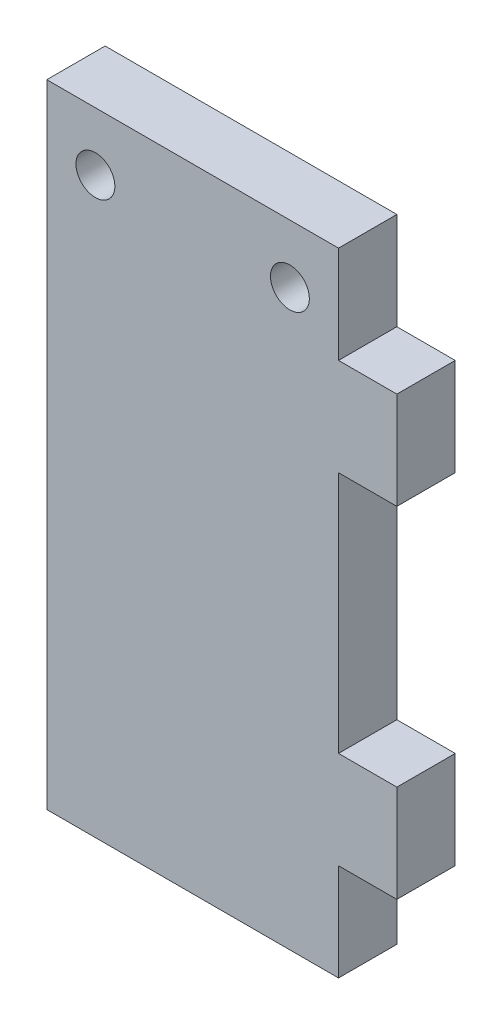
ISO-10303-21;
HEADER;
FILE_DESCRIPTION(('STEP AP214'),'2;1');
FILE_NAME('part.step','',(''),(''),'','','');
FILE_SCHEMA(('AUTOMOTIVE_DESIGN { 1 0 10303 214 1 1 1 1 }'));
ENDSEC;
DATA;
#1=APPLICATION_CONTEXT('core data for automotive mechanical design processes');
#2=APPLICATION_PROTOCOL_DEFINITION('international standard','automotive_design',2000,#1);
#3=PRODUCT_CONTEXT('',#1,'mechanical');
#4=PRODUCT('Part','Part','',(#3));
#5=PRODUCT_RELATED_PRODUCT_CATEGORY('part','',(#4));
#6=PRODUCT_DEFINITION_FORMATION('','',#4);
#7=PRODUCT_DEFINITION_CONTEXT('part definition',#1,'design');
#8=PRODUCT_DEFINITION('design','',#6,#7);
#9=PRODUCT_DEFINITION_SHAPE('','',#8);
#10=(LENGTH_UNIT() NAMED_UNIT(*) SI_UNIT(.MILLI.,.METRE.));
#11=(NAMED_UNIT(*) PLANE_ANGLE_UNIT() SI_UNIT($,.RADIAN.));
#12=(NAMED_UNIT(*) SI_UNIT($,.STERADIAN.) SOLID_ANGLE_UNIT());
#13=UNCERTAINTY_MEASURE_WITH_UNIT(LENGTH_MEASURE(1.E-05),#10,'distance_accuracy_value','');
#14=(GEOMETRIC_REPRESENTATION_CONTEXT(3) GLOBAL_UNCERTAINTY_ASSIGNED_CONTEXT((#13)) GLOBAL_UNIT_ASSIGNED_CONTEXT((#10,
#11,#12)) REPRESENTATION_CONTEXT('',''));
#15=CARTESIAN_POINT('',(0.,0.,0.));
#16=DIRECTION('',(0.,0.,1.));
#17=DIRECTION('',(1.,0.,0.));
#18=AXIS2_PLACEMENT_3D('',#15,#16,#17);
#19=CARTESIAN_POINT('',(0.,0.,6.));
#20=DIRECTION('',(-1.,0.,0.));
#21=DIRECTION('',(0.,-1.,0.));
#22=AXIS2_PLACEMENT_3D('',#19,#20,#21);
#23=PLANE('',#22);
#24=DIRECTION('',(0.,0.,-1.));
#25=VECTOR('',#24,1.);
#26=CARTESIAN_POINT('',(0.,45.,6.));
#27=LINE('',#26,#25);
#28=CARTESIAN_POINT('',(0.,45.,6.));
#29=VERTEX_POINT('',#28);
#30=CARTESIAN_POINT('',(0.,45.,0.));
#31=VERTEX_POINT('',#30);
#32=EDGE_CURVE('E57',#29,#31,#27,.T.);
#33=ORIENTED_EDGE('',*,*,#32,.F.);
#34=DIRECTION('',(0.,1.,0.));
#35=VECTOR('',#34,1.);
#36=CARTESIAN_POINT('',(0.,0.,6.));
#37=LINE('',#36,#35);
#38=CARTESIAN_POINT('',(0.,20.,6.));
#39=VERTEX_POINT('',#38);
#40=EDGE_CURVE('E148',#39,#29,#37,.T.);
#41=ORIENTED_EDGE('',*,*,#40,.F.);
#42=DIRECTION('',(0.,0.,1.));
#43=VECTOR('',#42,1.);
#44=CARTESIAN_POINT('',(0.,20.,6.));
#45=LINE('',#44,#43);
#46=CARTESIAN_POINT('',(0.,20.,0.));
#47=VERTEX_POINT('',#46);
#48=EDGE_CURVE('E152',#47,#39,#45,.T.);
#49=ORIENTED_EDGE('',*,*,#48,.F.);
#50=DIRECTION('',(0.,1.,0.));
#51=VECTOR('',#50,1.);
#52=CARTESIAN_POINT('',(0.,0.,0.));
#53=LINE('',#52,#51);
#54=EDGE_CURVE('E195',#47,#31,#53,.T.);
#55=ORIENTED_EDGE('',*,*,#54,.T.);
#56=EDGE_LOOP('',(#33,#41,#49,#55));
#57=FACE_BOUND('',#56,.T.);
#58=ADVANCED_FACE('F33',(#57),#23,.F.);
#59=DIRECTION('',(0.,0.,1.));
#60=VECTOR('',#59,1.);
#61=CARTESIAN_POINT('',(0.,55.,6.));
#62=LINE('',#61,#60);
#63=CARTESIAN_POINT('',(0.,55.,0.));
#64=VERTEX_POINT('',#63);
#65=CARTESIAN_POINT('',(0.,55.,6.));
#66=VERTEX_POINT('',#65);
#67=EDGE_CURVE('E143',#64,#66,#62,.T.);
#68=ORIENTED_EDGE('',*,*,#67,.F.);
#69=CARTESIAN_POINT('',(0.,65.,0.));
#70=VERTEX_POINT('',#69);
#71=EDGE_CURVE('E183',#64,#70,#53,.T.);
#72=ORIENTED_EDGE('',*,*,#71,.T.);
#73=DIRECTION('',(0.,0.,-1.));
#74=VECTOR('',#73,1.);
#75=CARTESIAN_POINT('',(0.,65.,6.));
#76=LINE('',#75,#74);
#77=CARTESIAN_POINT('',(0.,65.,6.));
#78=VERTEX_POINT('',#77);
#79=EDGE_CURVE('E11',#78,#70,#76,.T.);
#80=ORIENTED_EDGE('',*,*,#79,.F.);
#81=EDGE_CURVE('E36',#66,#78,#37,.T.);
#82=ORIENTED_EDGE('',*,*,#81,.F.);
#83=EDGE_LOOP('',(#68,#72,#80,#82));
#84=FACE_BOUND('',#83,.T.);
#85=ADVANCED_FACE('F248',(#84),#23,.F.);
#86=DIRECTION('',(0.,0.,-1.));
#87=VECTOR('',#86,1.);
#88=CARTESIAN_POINT('',(0.,10.,6.));
#89=LINE('',#88,#87);
#90=CARTESIAN_POINT('',(0.,10.,6.));
#91=VERTEX_POINT('',#90);
#92=CARTESIAN_POINT('',(0.,10.,0.));
#93=VERTEX_POINT('',#92);
#94=EDGE_CURVE('E149',#91,#93,#89,.T.);
#95=ORIENTED_EDGE('',*,*,#94,.F.);
#96=CARTESIAN_POINT('',(0.,0.,6.));
#97=VERTEX_POINT('',#96);
#98=EDGE_CURVE('E241',#97,#91,#37,.T.);
#99=ORIENTED_EDGE('',*,*,#98,.F.);
#100=DIRECTION('',(0.,0.,-1.));
#101=VECTOR('',#100,1.);
#102=CARTESIAN_POINT('',(0.,0.,6.));
#103=LINE('',#102,#101);
#104=CARTESIAN_POINT('',(0.,0.,0.));
#105=VERTEX_POINT('',#104);
#106=EDGE_CURVE('E214',#97,#105,#103,.T.);
#107=ORIENTED_EDGE('',*,*,#106,.T.);
#108=EDGE_CURVE('E207',#105,#93,#53,.T.);
#109=ORIENTED_EDGE('',*,*,#108,.T.);
#110=EDGE_LOOP('',(#95,#99,#107,#109));
#111=FACE_BOUND('',#110,.T.);
#112=ADVANCED_FACE('F240',(#111),#23,.F.);
#113=CARTESIAN_POINT('',(0.,65.,6.));
#114=DIRECTION('',(0.,-1.,0.));
#115=DIRECTION('',(0.,0.,-1.));
#116=AXIS2_PLACEMENT_3D('',#113,#114,#115);
#117=PLANE('',#116);
#118=DIRECTION('',(-1.,0.,0.));
#119=VECTOR('',#118,1.);
#120=CARTESIAN_POINT('',(0.,65.,0.));
#121=LINE('',#120,#119);
#122=CARTESIAN_POINT('',(-30.,65.,0.));
#123=VERTEX_POINT('',#122);
#124=EDGE_CURVE('E201',#70,#123,#121,.T.);
#125=ORIENTED_EDGE('',*,*,#124,.T.);
#126=DIRECTION('',(0.,0.,-1.));
#127=VECTOR('',#126,1.);
#128=CARTESIAN_POINT('',(-30.,65.,6.));
#129=LINE('',#128,#127);
#130=CARTESIAN_POINT('',(-30.,65.,6.));
#131=VERTEX_POINT('',#130);
#132=EDGE_CURVE('E42',#131,#123,#129,.T.);
#133=ORIENTED_EDGE('',*,*,#132,.F.);
#134=DIRECTION('',(-1.,0.,0.));
#135=VECTOR('',#134,1.);
#136=CARTESIAN_POINT('',(0.,65.,6.));
#137=LINE('',#136,#135);
#138=EDGE_CURVE('E243',#78,#131,#137,.T.);
#139=ORIENTED_EDGE('',*,*,#138,.F.);
#140=ORIENTED_EDGE('',*,*,#79,.T.);
#141=EDGE_LOOP('',(#125,#133,#139,#140));
#142=FACE_BOUND('',#141,.T.);
#143=ADVANCED_FACE('F225',(#142),#117,.F.);
#144=CARTESIAN_POINT('',(-30.,0.,6.));
#145=DIRECTION('',(1.,0.,0.));
#146=DIRECTION('',(0.,0.,-1.));
#147=AXIS2_PLACEMENT_3D('',#144,#145,#146);
#148=PLANE('',#147);
#149=DIRECTION('',(0.,-1.,0.));
#150=VECTOR('',#149,1.);
#151=CARTESIAN_POINT('',(-30.,0.,0.));
#152=LINE('',#151,#150);
#153=CARTESIAN_POINT('',(-30.,0.,0.));
#154=VERTEX_POINT('',#153);
#155=EDGE_CURVE('E218',#123,#154,#152,.T.);
#156=ORIENTED_EDGE('',*,*,#155,.T.);
#157=DIRECTION('',(0.,0.,-1.));
#158=VECTOR('',#157,1.);
#159=CARTESIAN_POINT('',(-30.,0.,6.));
#160=LINE('',#159,#158);
#161=CARTESIAN_POINT('',(-30.,0.,6.));
#162=VERTEX_POINT('',#161);
#163=EDGE_CURVE('E211',#162,#154,#160,.T.);
#164=ORIENTED_EDGE('',*,*,#163,.F.);
#165=DIRECTION('',(0.,-1.,0.));
#166=VECTOR('',#165,1.);
#167=CARTESIAN_POINT('',(-30.,0.,6.));
#168=LINE('',#167,#166);
#169=EDGE_CURVE('E230',#131,#162,#168,.T.);
#170=ORIENTED_EDGE('',*,*,#169,.F.);
#171=ORIENTED_EDGE('',*,*,#132,.T.);
#172=EDGE_LOOP('',(#156,#164,#170,#171));
#173=FACE_BOUND('',#172,.T.);
#174=ADVANCED_FACE('F229',(#173),#148,.F.);
#175=CARTESIAN_POINT('',(0.,0.,6.));
#176=DIRECTION('',(0.,1.,0.));
#177=DIRECTION('',(-1.,0.,0.));
#178=AXIS2_PLACEMENT_3D('',#175,#176,#177);
#179=PLANE('',#178);
#180=DIRECTION('',(1.,0.,0.));
#181=VECTOR('',#180,1.);
#182=CARTESIAN_POINT('',(0.,0.,0.));
#183=LINE('',#182,#181);
#184=EDGE_CURVE('E217',#154,#105,#183,.T.);
#185=ORIENTED_EDGE('',*,*,#184,.T.);
#186=ORIENTED_EDGE('',*,*,#106,.F.);
#187=DIRECTION('',(1.,0.,0.));
#188=VECTOR('',#187,1.);
#189=CARTESIAN_POINT('',(0.,0.,6.));
#190=LINE('',#189,#188);
#191=EDGE_CURVE('E199',#162,#97,#190,.T.);
#192=ORIENTED_EDGE('',*,*,#191,.F.);
#193=ORIENTED_EDGE('',*,*,#163,.T.);
#194=EDGE_LOOP('',(#185,#186,#192,#193));
#195=FACE_BOUND('',#194,.T.);
#196=ADVANCED_FACE('F236',(#195),#179,.F.);
#197=CARTESIAN_POINT('',(0.,0.,6.));
#198=DIRECTION('',(0.,0.,1.));
#199=DIRECTION('',(1.,0.,0.));
#200=AXIS2_PLACEMENT_3D('',#197,#198,#199);
#201=PLANE('',#200);
#202=CARTESIAN_POINT('',(-5.,59.,6.));
#203=DIRECTION('',(0.,0.,1.));
#204=DIRECTION('',(1.,0.,0.));
#205=AXIS2_PLACEMENT_3D('',#202,#203,#204);
#206=CIRCLE('',#205,2.);
#207=CARTESIAN_POINT('',(-2.99999999999999,59.,6.));
#208=VERTEX_POINT('',#207);
#209=EDGE_CURVE('E269',#208,#208,#206,.T.);
#210=ORIENTED_EDGE('',*,*,#209,.F.);
#211=EDGE_LOOP('',(#210));
#212=FACE_BOUND('',#211,.T.);
#213=CARTESIAN_POINT('',(-25.,59.,6.));
#214=DIRECTION('',(0.,0.,1.));
#215=DIRECTION('',(1.,0.,0.));
#216=AXIS2_PLACEMENT_3D('',#213,#214,#215);
#217=CIRCLE('',#216,2.00000000000001);
#218=CARTESIAN_POINT('',(-23.,59.,6.));
#219=VERTEX_POINT('',#218);
#220=EDGE_CURVE('E261',#219,#219,#217,.T.);
#221=ORIENTED_EDGE('',*,*,#220,.F.);
#222=EDGE_LOOP('',(#221));
#223=FACE_BOUND('',#222,.T.);
#224=ORIENTED_EDGE('',*,*,#98,.T.);
#225=DIRECTION('',(-1.,0.,0.));
#226=VECTOR('',#225,1.);
#227=CARTESIAN_POINT('',(6.,10.,6.));
#228=LINE('',#227,#226);
#229=CARTESIAN_POINT('',(6.,10.,6.));
#230=VERTEX_POINT('',#229);
#231=EDGE_CURVE('E177',#230,#91,#228,.T.);
#232=ORIENTED_EDGE('',*,*,#231,.F.);
#233=DIRECTION('',(0.,-1.,0.));
#234=VECTOR('',#233,1.);
#235=CARTESIAN_POINT('',(6.,20.,6.));
#236=LINE('',#235,#234);
#237=CARTESIAN_POINT('',(6.,20.,6.));
#238=VERTEX_POINT('',#237);
#239=EDGE_CURVE('E158',#238,#230,#236,.T.);
#240=ORIENTED_EDGE('',*,*,#239,.F.);
#241=DIRECTION('',(-1.,0.,0.));
#242=VECTOR('',#241,1.);
#243=CARTESIAN_POINT('',(6.,20.,6.));
#244=LINE('',#243,#242);
#245=EDGE_CURVE('E167',#238,#39,#244,.T.);
#246=ORIENTED_EDGE('',*,*,#245,.T.);
#247=ORIENTED_EDGE('',*,*,#40,.T.);
#248=DIRECTION('',(-1.,0.,0.));
#249=VECTOR('',#248,1.);
#250=CARTESIAN_POINT('',(6.,45.,6.));
#251=LINE('',#250,#249);
#252=CARTESIAN_POINT('',(6.,45.,6.));
#253=VERTEX_POINT('',#252);
#254=EDGE_CURVE('E128',#253,#29,#251,.T.);
#255=ORIENTED_EDGE('',*,*,#254,.F.);
#256=DIRECTION('',(0.,-1.,0.));
#257=VECTOR('',#256,1.);
#258=CARTESIAN_POINT('',(6.,55.,6.));
#259=LINE('',#258,#257);
#260=CARTESIAN_POINT('',(6.,55.,6.));
#261=VERTEX_POINT('',#260);
#262=EDGE_CURVE('E134',#261,#253,#259,.T.);
#263=ORIENTED_EDGE('',*,*,#262,.F.);
#264=DIRECTION('',(-1.,0.,0.));
#265=VECTOR('',#264,1.);
#266=CARTESIAN_POINT('',(6.,55.,6.));
#267=LINE('',#266,#265);
#268=EDGE_CURVE('E252',#261,#66,#267,.T.);
#269=ORIENTED_EDGE('',*,*,#268,.T.);
#270=ORIENTED_EDGE('',*,*,#81,.T.);
#271=ORIENTED_EDGE('',*,*,#138,.T.);
#272=ORIENTED_EDGE('',*,*,#169,.T.);
#273=ORIENTED_EDGE('',*,*,#191,.T.);
#274=EDGE_LOOP('',(#224,#232,#240,#246,#247,#255,#263,#269,#270,#271,#272,#273));
#275=FACE_BOUND('',#274,.T.);
#276=ADVANCED_FACE('F146',(#212,#223,#275),#201,.T.);
#277=CARTESIAN_POINT('',(0.,0.,0.));
#278=DIRECTION('',(0.,0.,1.));
#279=DIRECTION('',(1.,0.,0.));
#280=AXIS2_PLACEMENT_3D('',#277,#278,#279);
#281=PLANE('',#280);
#282=CARTESIAN_POINT('',(-5.,59.,0.));
#283=DIRECTION('',(0.,0.,1.));
#284=DIRECTION('',(1.,0.,0.));
#285=AXIS2_PLACEMENT_3D('',#282,#283,#284);
#286=CIRCLE('',#285,2.);
#287=CARTESIAN_POINT('',(-2.99999999999999,59.,0.));
#288=VERTEX_POINT('',#287);
#289=EDGE_CURVE('E266',#288,#288,#286,.T.);
#290=ORIENTED_EDGE('',*,*,#289,.T.);
#291=EDGE_LOOP('',(#290));
#292=FACE_BOUND('',#291,.T.);
#293=CARTESIAN_POINT('',(-25.,59.,0.));
#294=DIRECTION('',(0.,0.,1.));
#295=DIRECTION('',(1.,0.,0.));
#296=AXIS2_PLACEMENT_3D('',#293,#294,#295);
#297=CIRCLE('',#296,2.00000000000001);
#298=CARTESIAN_POINT('',(-23.,59.,0.));
#299=VERTEX_POINT('',#298);
#300=EDGE_CURVE('E259',#299,#299,#297,.T.);
#301=ORIENTED_EDGE('',*,*,#300,.T.);
#302=EDGE_LOOP('',(#301));
#303=FACE_BOUND('',#302,.T.);
#304=ORIENTED_EDGE('',*,*,#108,.F.);
#305=ORIENTED_EDGE('',*,*,#184,.F.);
#306=ORIENTED_EDGE('',*,*,#155,.F.);
#307=ORIENTED_EDGE('',*,*,#124,.F.);
#308=ORIENTED_EDGE('',*,*,#71,.F.);
#309=DIRECTION('',(-1.,0.,0.));
#310=VECTOR('',#309,1.);
#311=CARTESIAN_POINT('',(6.,55.,0.));
#312=LINE('',#311,#310);
#313=CARTESIAN_POINT('',(6.,55.,0.));
#314=VERTEX_POINT('',#313);
#315=EDGE_CURVE('E154',#314,#64,#312,.T.);
#316=ORIENTED_EDGE('',*,*,#315,.F.);
#317=DIRECTION('',(0.,1.,0.));
#318=VECTOR('',#317,1.);
#319=CARTESIAN_POINT('',(6.,55.,0.));
#320=LINE('',#319,#318);
#321=CARTESIAN_POINT('',(6.,45.,0.));
#322=VERTEX_POINT('',#321);
#323=EDGE_CURVE('E133',#322,#314,#320,.T.);
#324=ORIENTED_EDGE('',*,*,#323,.F.);
#325=DIRECTION('',(-1.,0.,0.));
#326=VECTOR('',#325,1.);
#327=CARTESIAN_POINT('',(6.,45.,0.));
#328=LINE('',#327,#326);
#329=EDGE_CURVE('E130',#322,#31,#328,.T.);
#330=ORIENTED_EDGE('',*,*,#329,.T.);
#331=ORIENTED_EDGE('',*,*,#54,.F.);
#332=DIRECTION('',(-1.,0.,0.));
#333=VECTOR('',#332,1.);
#334=CARTESIAN_POINT('',(6.,20.,0.));
#335=LINE('',#334,#333);
#336=CARTESIAN_POINT('',(6.,20.,0.));
#337=VERTEX_POINT('',#336);
#338=EDGE_CURVE('E178',#337,#47,#335,.T.);
#339=ORIENTED_EDGE('',*,*,#338,.F.);
#340=DIRECTION('',(0.,1.,0.));
#341=VECTOR('',#340,1.);
#342=CARTESIAN_POINT('',(6.,20.,0.));
#343=LINE('',#342,#341);
#344=CARTESIAN_POINT('',(6.,10.,0.));
#345=VERTEX_POINT('',#344);
#346=EDGE_CURVE('E163',#345,#337,#343,.T.);
#347=ORIENTED_EDGE('',*,*,#346,.F.);
#348=DIRECTION('',(-1.,0.,0.));
#349=VECTOR('',#348,1.);
#350=CARTESIAN_POINT('',(6.,10.,0.));
#351=LINE('',#350,#349);
#352=EDGE_CURVE('E174',#345,#93,#351,.T.);
#353=ORIENTED_EDGE('',*,*,#352,.T.);
#354=EDGE_LOOP('',(#304,#305,#306,#307,#308,#316,#324,#330,#331,#339,#347,#353));
#355=FACE_BOUND('',#354,.T.);
#356=ADVANCED_FACE('F233',(#292,#303,#355),#281,.F.);
#357=CARTESIAN_POINT('',(6.,10.,6.));
#358=DIRECTION('',(0.,1.,0.));
#359=DIRECTION('',(-1.,0.,0.));
#360=AXIS2_PLACEMENT_3D('',#357,#358,#359);
#361=PLANE('',#360);
#362=ORIENTED_EDGE('',*,*,#94,.T.);
#363=ORIENTED_EDGE('',*,*,#352,.F.);
#364=DIRECTION('',(0.,0.,-1.));
#365=VECTOR('',#364,1.);
#366=CARTESIAN_POINT('',(6.,10.,6.));
#367=LINE('',#366,#365);
#368=EDGE_CURVE('E161',#230,#345,#367,.T.);
#369=ORIENTED_EDGE('',*,*,#368,.F.);
#370=ORIENTED_EDGE('',*,*,#231,.T.);
#371=EDGE_LOOP('',(#362,#363,#369,#370));
#372=FACE_BOUND('',#371,.T.);
#373=ADVANCED_FACE('F311',(#372),#361,.F.);
#374=CARTESIAN_POINT('',(6.,20.,6.));
#375=DIRECTION('',(0.,-1.,0.));
#376=DIRECTION('',(1.,0.,0.));
#377=AXIS2_PLACEMENT_3D('',#374,#375,#376);
#378=PLANE('',#377);
#379=ORIENTED_EDGE('',*,*,#48,.T.);
#380=ORIENTED_EDGE('',*,*,#245,.F.);
#381=DIRECTION('',(0.,0.,1.));
#382=VECTOR('',#381,1.);
#383=CARTESIAN_POINT('',(6.,20.,6.));
#384=LINE('',#383,#382);
#385=EDGE_CURVE('E165',#337,#238,#384,.T.);
#386=ORIENTED_EDGE('',*,*,#385,.F.);
#387=ORIENTED_EDGE('',*,*,#338,.T.);
#388=EDGE_LOOP('',(#379,#380,#386,#387));
#389=FACE_BOUND('',#388,.T.);
#390=ADVANCED_FACE('F315',(#389),#378,.F.);
#391=CARTESIAN_POINT('',(6.,0.,0.));
#392=DIRECTION('',(1.,0.,0.));
#393=DIRECTION('',(0.,1.,0.));
#394=AXIS2_PLACEMENT_3D('',#391,#392,#393);
#395=PLANE('',#394);
#396=ORIENTED_EDGE('',*,*,#239,.T.);
#397=ORIENTED_EDGE('',*,*,#368,.T.);
#398=ORIENTED_EDGE('',*,*,#346,.T.);
#399=ORIENTED_EDGE('',*,*,#385,.T.);
#400=EDGE_LOOP('',(#396,#397,#398,#399));
#401=FACE_BOUND('',#400,.T.);
#402=ADVANCED_FACE('F319',(#401),#395,.T.);
#403=CARTESIAN_POINT('',(6.,45.,6.));
#404=DIRECTION('',(0.,1.,0.));
#405=DIRECTION('',(-1.,0.,0.));
#406=AXIS2_PLACEMENT_3D('',#403,#404,#405);
#407=PLANE('',#406);
#408=ORIENTED_EDGE('',*,*,#32,.T.);
#409=ORIENTED_EDGE('',*,*,#329,.F.);
#410=DIRECTION('',(0.,0.,-1.));
#411=VECTOR('',#410,1.);
#412=CARTESIAN_POINT('',(6.,45.,6.));
#413=LINE('',#412,#411);
#414=EDGE_CURVE('E124',#253,#322,#413,.T.);
#415=ORIENTED_EDGE('',*,*,#414,.F.);
#416=ORIENTED_EDGE('',*,*,#254,.T.);
#417=EDGE_LOOP('',(#408,#409,#415,#416));
#418=FACE_BOUND('',#417,.T.);
#419=ADVANCED_FACE('F126',(#418),#407,.F.);
#420=CARTESIAN_POINT('',(6.,55.,6.));
#421=DIRECTION('',(0.,-1.,0.));
#422=DIRECTION('',(1.,0.,0.));
#423=AXIS2_PLACEMENT_3D('',#420,#421,#422);
#424=PLANE('',#423);
#425=ORIENTED_EDGE('',*,*,#67,.T.);
#426=ORIENTED_EDGE('',*,*,#268,.F.);
#427=DIRECTION('',(0.,0.,1.));
#428=VECTOR('',#427,1.);
#429=CARTESIAN_POINT('',(6.,55.,6.));
#430=LINE('',#429,#428);
#431=EDGE_CURVE('E139',#314,#261,#430,.T.);
#432=ORIENTED_EDGE('',*,*,#431,.F.);
#433=ORIENTED_EDGE('',*,*,#315,.T.);
#434=EDGE_LOOP('',(#425,#426,#432,#433));
#435=FACE_BOUND('',#434,.T.);
#436=ADVANCED_FACE('F253',(#435),#424,.F.);
#437=CARTESIAN_POINT('',(6.,0.,0.));
#438=DIRECTION('',(1.,0.,0.));
#439=DIRECTION('',(0.,1.,0.));
#440=AXIS2_PLACEMENT_3D('',#437,#438,#439);
#441=PLANE('',#440);
#442=ORIENTED_EDGE('',*,*,#262,.T.);
#443=ORIENTED_EDGE('',*,*,#414,.T.);
#444=ORIENTED_EDGE('',*,*,#323,.T.);
#445=ORIENTED_EDGE('',*,*,#431,.T.);
#446=EDGE_LOOP('',(#442,#443,#444,#445));
#447=FACE_BOUND('',#446,.T.);
#448=ADVANCED_FACE('F137',(#447),#441,.T.);
#449=CARTESIAN_POINT('',(-25.,59.,0.));
#450=DIRECTION('',(0.,0.,1.));
#451=DIRECTION('',(1.,0.,0.));
#452=AXIS2_PLACEMENT_3D('',#449,#450,#451);
#453=CYLINDRICAL_SURFACE('',#452,2.00000000000001);
#454=ORIENTED_EDGE('',*,*,#300,.F.);
#455=EDGE_LOOP('',(#454));
#456=FACE_BOUND('',#455,.T.);
#457=ORIENTED_EDGE('',*,*,#220,.T.);
#458=EDGE_LOOP('',(#457));
#459=FACE_BOUND('',#458,.T.);
#460=ADVANCED_FACE('F279',(#456,#459),#453,.F.);
#461=CARTESIAN_POINT('',(-5.,59.,0.));
#462=DIRECTION('',(0.,0.,1.));
#463=DIRECTION('',(1.,0.,0.));
#464=AXIS2_PLACEMENT_3D('',#461,#462,#463);
#465=CYLINDRICAL_SURFACE('',#464,2.);
#466=ORIENTED_EDGE('',*,*,#289,.F.);
#467=EDGE_LOOP('',(#466));
#468=FACE_BOUND('',#467,.T.);
#469=ORIENTED_EDGE('',*,*,#209,.T.);
#470=EDGE_LOOP('',(#469));
#471=FACE_BOUND('',#470,.T.);
#472=ADVANCED_FACE('F276',(#468,#471),#465,.F.);
#473=CLOSED_SHELL('',(#58,#85,#112,#143,#174,#196,#276,#356,#373,#390,#402,#419,#436,#448,#460,#472));
#474=MANIFOLD_SOLID_BREP('B2',#473);
#475=ADVANCED_BREP_SHAPE_REPRESENTATION('',(#18,#474),#14);
#476=SHAPE_DEFINITION_REPRESENTATION(#9,#475);
ENDSEC;
END-ISO-10303-21;
